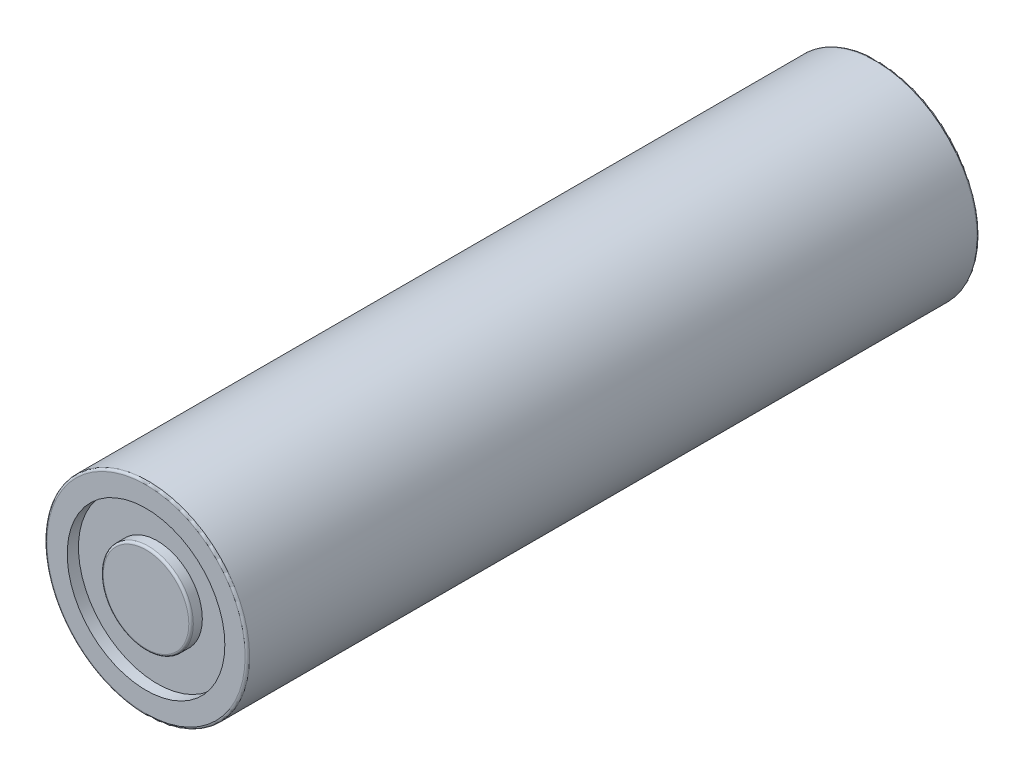
ISO-10303-21;
HEADER;
FILE_DESCRIPTION(('STEP AP214'),'2;1');
FILE_NAME('part.step','',(''),(''),'','','');
FILE_SCHEMA(('AUTOMOTIVE_DESIGN { 1 0 10303 214 1 1 1 1 }'));
ENDSEC;
DATA;
#1=APPLICATION_CONTEXT('core data for automotive mechanical design processes');
#2=APPLICATION_PROTOCOL_DEFINITION('international standard','automotive_design',2000,#1);
#3=PRODUCT_CONTEXT('',#1,'mechanical');
#4=PRODUCT('Part','Part','',(#3));
#5=PRODUCT_RELATED_PRODUCT_CATEGORY('part','',(#4));
#6=PRODUCT_DEFINITION_FORMATION('','',#4);
#7=PRODUCT_DEFINITION_CONTEXT('part definition',#1,'design');
#8=PRODUCT_DEFINITION('design','',#6,#7);
#9=PRODUCT_DEFINITION_SHAPE('','',#8);
#10=(LENGTH_UNIT() NAMED_UNIT(*) SI_UNIT(.MILLI.,.METRE.));
#11=(NAMED_UNIT(*) PLANE_ANGLE_UNIT() SI_UNIT($,.RADIAN.));
#12=(NAMED_UNIT(*) SI_UNIT($,.STERADIAN.) SOLID_ANGLE_UNIT());
#13=UNCERTAINTY_MEASURE_WITH_UNIT(LENGTH_MEASURE(1.E-05),#10,'distance_accuracy_value','');
#14=(GEOMETRIC_REPRESENTATION_CONTEXT(3) GLOBAL_UNCERTAINTY_ASSIGNED_CONTEXT((#13)) GLOBAL_UNIT_ASSIGNED_CONTEXT((#10,
#11,#12)) REPRESENTATION_CONTEXT('',''));
#15=CARTESIAN_POINT('',(0.,0.,0.));
#16=DIRECTION('',(0.,0.,1.));
#17=DIRECTION('',(1.,0.,0.));
#18=AXIS2_PLACEMENT_3D('',#15,#16,#17);
#19=CARTESIAN_POINT('',(0.,0.,32.5));
#20=DIRECTION('',(0.,0.,-1.));
#21=DIRECTION('',(-1.,0.,0.));
#22=AXIS2_PLACEMENT_3D('',#19,#20,#21);
#23=CYLINDRICAL_SURFACE('',#22,9.);
#24=CARTESIAN_POINT('',(0.,0.,-32.3));
#25=DIRECTION('',(0.,0.,1.));
#26=DIRECTION('',(1.,0.,0.));
#27=AXIS2_PLACEMENT_3D('',#24,#25,#26);
#28=CIRCLE('',#27,9.);
#29=CARTESIAN_POINT('',(9.,0.,-32.3));
#30=VERTEX_POINT('',#29);
#31=EDGE_CURVE('E42',#30,#30,#28,.T.);
#32=ORIENTED_EDGE('',*,*,#31,.T.);
#33=EDGE_LOOP('',(#32));
#34=FACE_BOUND('',#33,.T.);
#35=CARTESIAN_POINT('',(0.,0.,32.3));
#36=DIRECTION('',(0.,0.,1.));
#37=DIRECTION('',(1.,0.,0.));
#38=AXIS2_PLACEMENT_3D('',#35,#36,#37);
#39=CIRCLE('',#38,9.);
#40=CARTESIAN_POINT('',(9.,0.,32.3));
#41=VERTEX_POINT('',#40);
#42=EDGE_CURVE('E46',#41,#41,#39,.F.);
#43=ORIENTED_EDGE('',*,*,#42,.T.);
#44=EDGE_LOOP('',(#43));
#45=FACE_BOUND('',#44,.T.);
#46=ADVANCED_FACE('F31',(#34,#45),#23,.T.);
#47=CARTESIAN_POINT('',(0.,0.,32.5));
#48=DIRECTION('',(0.,0.,1.));
#49=DIRECTION('',(1.,0.,0.));
#50=AXIS2_PLACEMENT_3D('',#47,#48,#49);
#51=PLANE('',#50);
#52=CARTESIAN_POINT('',(0.,0.,32.5));
#53=DIRECTION('',(0.,0.,1.));
#54=DIRECTION('',(1.,0.,0.));
#55=AXIS2_PLACEMENT_3D('',#52,#53,#54);
#56=CIRCLE('',#55,8.8);
#57=CARTESIAN_POINT('',(8.8,0.,32.5));
#58=VERTEX_POINT('',#57);
#59=EDGE_CURVE('E10',#58,#58,#56,.T.);
#60=ORIENTED_EDGE('',*,*,#59,.T.);
#61=EDGE_LOOP('',(#60));
#62=FACE_BOUND('',#61,.T.);
#63=CARTESIAN_POINT('',(0.,0.,32.5));
#64=DIRECTION('',(0.,0.,1.));
#65=DIRECTION('',(1.,0.,0.));
#66=AXIS2_PLACEMENT_3D('',#63,#64,#65);
#67=CIRCLE('',#66,7.);
#68=CARTESIAN_POINT('',(7.,0.,32.5));
#69=VERTEX_POINT('',#68);
#70=EDGE_CURVE('E58',#69,#69,#67,.T.);
#71=ORIENTED_EDGE('',*,*,#70,.F.);
#72=EDGE_LOOP('',(#71));
#73=FACE_BOUND('',#72,.T.);
#74=ADVANCED_FACE('F82',(#62,#73),#51,.T.);
#75=CARTESIAN_POINT('',(0.,0.,-32.5));
#76=DIRECTION('',(0.,0.,1.));
#77=DIRECTION('',(1.,0.,0.));
#78=AXIS2_PLACEMENT_3D('',#75,#76,#77);
#79=PLANE('',#78);
#80=CARTESIAN_POINT('',(0.,0.,-32.5));
#81=DIRECTION('',(0.,0.,1.));
#82=DIRECTION('',(1.,0.,0.));
#83=AXIS2_PLACEMENT_3D('',#80,#81,#82);
#84=CIRCLE('',#83,8.8);
#85=CARTESIAN_POINT('',(8.8,0.,-32.5));
#86=VERTEX_POINT('',#85);
#87=EDGE_CURVE('E38',#86,#86,#84,.F.);
#88=ORIENTED_EDGE('',*,*,#87,.T.);
#89=EDGE_LOOP('',(#88));
#90=FACE_BOUND('',#89,.T.);
#91=ADVANCED_FACE('F78',(#90),#79,.F.);
#92=CARTESIAN_POINT('',(0.,0.,31.5));
#93=DIRECTION('',(0.,0.,1.));
#94=DIRECTION('',(1.,0.,0.));
#95=AXIS2_PLACEMENT_3D('',#92,#93,#94);
#96=CYLINDRICAL_SURFACE('',#95,7.);
#97=CARTESIAN_POINT('',(0.,0.,31.5));
#98=DIRECTION('',(0.,0.,1.));
#99=DIRECTION('',(1.,0.,0.));
#100=AXIS2_PLACEMENT_3D('',#97,#98,#99);
#101=CIRCLE('',#100,7.);
#102=CARTESIAN_POINT('',(7.,0.,31.5));
#103=VERTEX_POINT('',#102);
#104=EDGE_CURVE('E57',#103,#103,#101,.T.);
#105=ORIENTED_EDGE('',*,*,#104,.F.);
#106=EDGE_LOOP('',(#105));
#107=FACE_BOUND('',#106,.T.);
#108=ORIENTED_EDGE('',*,*,#70,.T.);
#109=EDGE_LOOP('',(#108));
#110=FACE_BOUND('',#109,.T.);
#111=ADVANCED_FACE('F72',(#107,#110),#96,.F.);
#112=CARTESIAN_POINT('',(0.,0.,31.5));
#113=DIRECTION('',(0.,0.,1.));
#114=DIRECTION('',(1.,0.,0.));
#115=AXIS2_PLACEMENT_3D('',#112,#113,#114);
#116=PLANE('',#115);
#117=CARTESIAN_POINT('',(0.,0.,31.5));
#118=DIRECTION('',(0.,0.,1.));
#119=DIRECTION('',(1.,0.,0.));
#120=AXIS2_PLACEMENT_3D('',#117,#118,#119);
#121=CIRCLE('',#120,4.);
#122=CARTESIAN_POINT('',(4.,0.,31.5));
#123=VERTEX_POINT('',#122);
#124=EDGE_CURVE('E61',#123,#123,#121,.T.);
#125=ORIENTED_EDGE('',*,*,#124,.F.);
#126=EDGE_LOOP('',(#125));
#127=FACE_BOUND('',#126,.T.);
#128=ORIENTED_EDGE('',*,*,#104,.T.);
#129=EDGE_LOOP('',(#128));
#130=FACE_BOUND('',#129,.T.);
#131=ADVANCED_FACE('F69',(#127,#130),#116,.T.);
#132=CARTESIAN_POINT('',(0.,0.,31.5));
#133=DIRECTION('',(0.,0.,1.));
#134=DIRECTION('',(1.,0.,0.));
#135=AXIS2_PLACEMENT_3D('',#132,#133,#134);
#136=CYLINDRICAL_SURFACE('',#135,4.);
#137=CARTESIAN_POINT('',(0.,0.,32.3));
#138=DIRECTION('',(0.,0.,1.));
#139=DIRECTION('',(1.,0.,0.));
#140=AXIS2_PLACEMENT_3D('',#137,#138,#139);
#141=CIRCLE('',#140,4.);
#142=CARTESIAN_POINT('',(4.,0.,32.3));
#143=VERTEX_POINT('',#142);
#144=EDGE_CURVE('E51',#143,#143,#141,.F.);
#145=ORIENTED_EDGE('',*,*,#144,.T.);
#146=EDGE_LOOP('',(#145));
#147=FACE_BOUND('',#146,.T.);
#148=ORIENTED_EDGE('',*,*,#124,.T.);
#149=EDGE_LOOP('',(#148));
#150=FACE_BOUND('',#149,.T.);
#151=ADVANCED_FACE('F67',(#147,#150),#136,.T.);
#152=CARTESIAN_POINT('',(0.,0.,32.5));
#153=DIRECTION('',(0.,0.,1.));
#154=DIRECTION('',(1.,0.,0.));
#155=AXIS2_PLACEMENT_3D('',#152,#153,#154);
#156=CIRCLE('',#155,3.8);
#157=CARTESIAN_POINT('',(3.8,0.,32.5));
#158=VERTEX_POINT('',#157);
#159=EDGE_CURVE('E54',#158,#158,#156,.T.);
#160=ORIENTED_EDGE('',*,*,#159,.T.);
#161=EDGE_LOOP('',(#160));
#162=FACE_BOUND('',#161,.T.);
#163=ADVANCED_FACE('F85',(#162),#51,.T.);
#164=CARTESIAN_POINT('',(0.,0.,32.3));
#165=DIRECTION('',(0.,0.,1.));
#166=DIRECTION('',(1.,0.,0.));
#167=AXIS2_PLACEMENT_3D('',#164,#165,#166);
#168=TOROIDAL_SURFACE('',#167,3.8,0.2);
#169=ORIENTED_EDGE('',*,*,#144,.F.);
#170=EDGE_LOOP('',(#169));
#171=FACE_BOUND('',#170,.T.);
#172=ORIENTED_EDGE('',*,*,#159,.F.);
#173=EDGE_LOOP('',(#172));
#174=FACE_BOUND('',#173,.T.);
#175=ADVANCED_FACE('F94',(#171,#174),#168,.T.);
#176=CARTESIAN_POINT('',(0.,0.,-32.3));
#177=DIRECTION('',(0.,0.,1.));
#178=DIRECTION('',(1.,0.,0.));
#179=AXIS2_PLACEMENT_3D('',#176,#177,#178);
#180=TOROIDAL_SURFACE('',#179,8.8,0.2);
#181=ORIENTED_EDGE('',*,*,#87,.F.);
#182=EDGE_LOOP('',(#181));
#183=FACE_BOUND('',#182,.T.);
#184=ORIENTED_EDGE('',*,*,#31,.F.);
#185=EDGE_LOOP('',(#184));
#186=FACE_BOUND('',#185,.T.);
#187=ADVANCED_FACE('F101',(#183,#186),#180,.T.);
#188=CARTESIAN_POINT('',(0.,0.,32.3));
#189=DIRECTION('',(0.,0.,1.));
#190=DIRECTION('',(1.,0.,0.));
#191=AXIS2_PLACEMENT_3D('',#188,#189,#190);
#192=TOROIDAL_SURFACE('',#191,8.8,0.2);
#193=ORIENTED_EDGE('',*,*,#42,.F.);
#194=EDGE_LOOP('',(#193));
#195=FACE_BOUND('',#194,.T.);
#196=ORIENTED_EDGE('',*,*,#59,.F.);
#197=EDGE_LOOP('',(#196));
#198=FACE_BOUND('',#197,.T.);
#199=ADVANCED_FACE('F33',(#195,#198),#192,.T.);
#200=CLOSED_SHELL('',(#46,#74,#91,#111,#131,#151,#163,#175,#187,#199));
#201=MANIFOLD_SOLID_BREP('B2',#200);
#202=ADVANCED_BREP_SHAPE_REPRESENTATION('',(#18,#201),#14);
#203=SHAPE_DEFINITION_REPRESENTATION(#9,#202);
ENDSEC;
END-ISO-10303-21;
